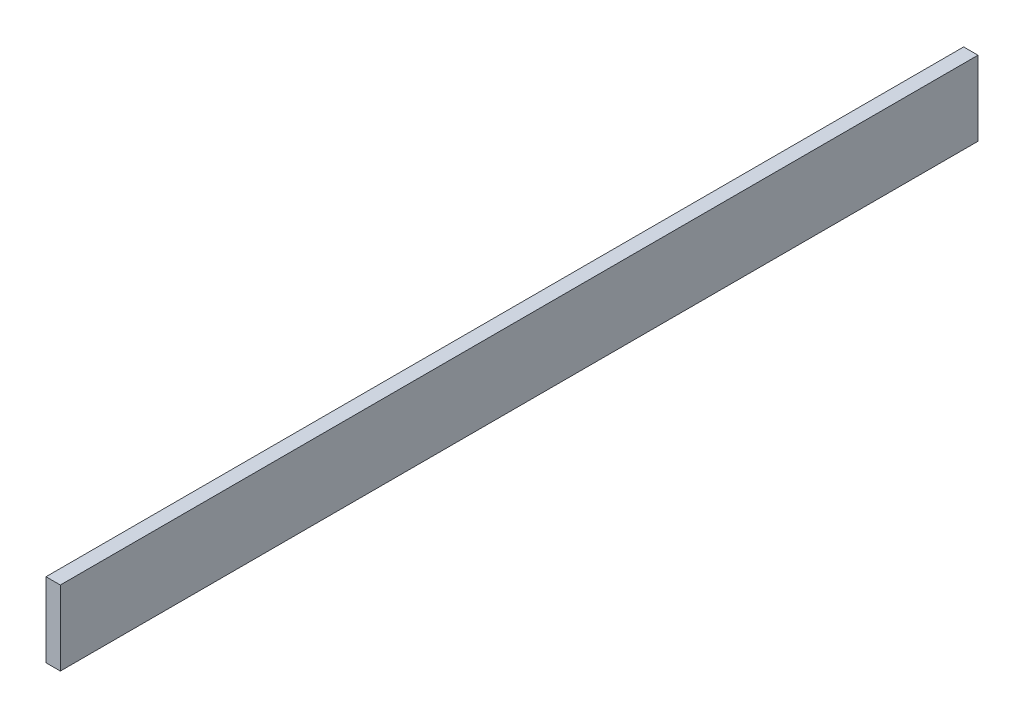
ISO-10303-21;
HEADER;
FILE_DESCRIPTION(('STEP AP214'),'2;1');
FILE_NAME('part.step','',(''),(''),'','','');
FILE_SCHEMA(('AUTOMOTIVE_DESIGN { 1 0 10303 214 1 1 1 1 }'));
ENDSEC;
DATA;
#1=APPLICATION_CONTEXT('core data for automotive mechanical design processes');
#2=APPLICATION_PROTOCOL_DEFINITION('international standard','automotive_design',2000,#1);
#3=PRODUCT_CONTEXT('',#1,'mechanical');
#4=PRODUCT('Part','Part','',(#3));
#5=PRODUCT_RELATED_PRODUCT_CATEGORY('part','',(#4));
#6=PRODUCT_DEFINITION_FORMATION('','',#4);
#7=PRODUCT_DEFINITION_CONTEXT('part definition',#1,'design');
#8=PRODUCT_DEFINITION('design','',#6,#7);
#9=PRODUCT_DEFINITION_SHAPE('','',#8);
#10=(LENGTH_UNIT() NAMED_UNIT(*) SI_UNIT(.MILLI.,.METRE.));
#11=(NAMED_UNIT(*) PLANE_ANGLE_UNIT() SI_UNIT($,.RADIAN.));
#12=(NAMED_UNIT(*) SI_UNIT($,.STERADIAN.) SOLID_ANGLE_UNIT());
#13=UNCERTAINTY_MEASURE_WITH_UNIT(LENGTH_MEASURE(1.E-05),#10,'distance_accuracy_value','');
#14=(GEOMETRIC_REPRESENTATION_CONTEXT(3) GLOBAL_UNCERTAINTY_ASSIGNED_CONTEXT((#13)) GLOBAL_UNIT_ASSIGNED_CONTEXT((#10,
#11,#12)) REPRESENTATION_CONTEXT('',''));
#15=CARTESIAN_POINT('',(0.,0.,0.));
#16=DIRECTION('',(0.,0.,1.));
#17=DIRECTION('',(1.,0.,0.));
#18=AXIS2_PLACEMENT_3D('',#15,#16,#17);
#19=CARTESIAN_POINT('',(6.35,0.,0.));
#20=DIRECTION('',(0.,0.,-1.));
#21=DIRECTION('',(-1.,0.,0.));
#22=AXIS2_PLACEMENT_3D('',#19,#20,#21);
#23=PLANE('',#22);
#24=DIRECTION('',(0.,-1.,0.));
#25=VECTOR('',#24,1.);
#26=CARTESIAN_POINT('',(0.,0.,0.));
#27=LINE('',#26,#25);
#28=CARTESIAN_POINT('',(0.,33.02,0.));
#29=VERTEX_POINT('',#28);
#30=CARTESIAN_POINT('',(0.,0.,0.));
#31=VERTEX_POINT('',#30);
#32=EDGE_CURVE('E99',#29,#31,#27,.T.);
#33=ORIENTED_EDGE('',*,*,#32,.T.);
#34=DIRECTION('',(-1.,0.,0.));
#35=VECTOR('',#34,1.);
#36=CARTESIAN_POINT('',(6.35,0.,0.));
#37=LINE('',#36,#35);
#38=CARTESIAN_POINT('',(6.35,0.,0.));
#39=VERTEX_POINT('',#38);
#40=EDGE_CURVE('E11',#39,#31,#37,.T.);
#41=ORIENTED_EDGE('',*,*,#40,.F.);
#42=DIRECTION('',(0.,-1.,0.));
#43=VECTOR('',#42,1.);
#44=CARTESIAN_POINT('',(6.35,0.,0.));
#45=LINE('',#44,#43);
#46=CARTESIAN_POINT('',(6.35,33.02,0.));
#47=VERTEX_POINT('',#46);
#48=EDGE_CURVE('E87',#47,#39,#45,.T.);
#49=ORIENTED_EDGE('',*,*,#48,.F.);
#50=DIRECTION('',(-1.,0.,0.));
#51=VECTOR('',#50,1.);
#52=CARTESIAN_POINT('',(6.35,33.02,0.));
#53=LINE('',#52,#51);
#54=EDGE_CURVE('E95',#47,#29,#53,.T.);
#55=ORIENTED_EDGE('',*,*,#54,.T.);
#56=EDGE_LOOP('',(#33,#41,#49,#55));
#57=FACE_BOUND('',#56,.T.);
#58=ADVANCED_FACE('F36',(#57),#23,.F.);
#59=CARTESIAN_POINT('',(6.35,0.,0.));
#60=DIRECTION('',(0.,1.,0.));
#61=DIRECTION('',(0.,0.,1.));
#62=AXIS2_PLACEMENT_3D('',#59,#60,#61);
#63=PLANE('',#62);
#64=DIRECTION('',(0.,0.,-1.));
#65=VECTOR('',#64,1.);
#66=CARTESIAN_POINT('',(0.,0.,0.));
#67=LINE('',#66,#65);
#68=CARTESIAN_POINT('',(0.,0.,-406.4));
#69=VERTEX_POINT('',#68);
#70=EDGE_CURVE('E91',#31,#69,#67,.T.);
#71=ORIENTED_EDGE('',*,*,#70,.T.);
#72=DIRECTION('',(-1.,0.,0.));
#73=VECTOR('',#72,1.);
#74=CARTESIAN_POINT('',(6.35,0.,-406.4));
#75=LINE('',#74,#73);
#76=CARTESIAN_POINT('',(6.35,0.,-406.4));
#77=VERTEX_POINT('',#76);
#78=EDGE_CURVE('E44',#77,#69,#75,.T.);
#79=ORIENTED_EDGE('',*,*,#78,.F.);
#80=DIRECTION('',(0.,0.,-1.));
#81=VECTOR('',#80,1.);
#82=CARTESIAN_POINT('',(6.35,0.,0.));
#83=LINE('',#82,#81);
#84=EDGE_CURVE('E82',#39,#77,#83,.T.);
#85=ORIENTED_EDGE('',*,*,#84,.F.);
#86=ORIENTED_EDGE('',*,*,#40,.T.);
#87=EDGE_LOOP('',(#71,#79,#85,#86));
#88=FACE_BOUND('',#87,.T.);
#89=ADVANCED_FACE('F90',(#88),#63,.F.);
#90=CARTESIAN_POINT('',(6.35,0.,-406.4));
#91=DIRECTION('',(0.,0.,1.));
#92=DIRECTION('',(1.,0.,0.));
#93=AXIS2_PLACEMENT_3D('',#90,#91,#92);
#94=PLANE('',#93);
#95=DIRECTION('',(0.,1.,0.));
#96=VECTOR('',#95,1.);
#97=CARTESIAN_POINT('',(0.,0.,-406.4));
#98=LINE('',#97,#96);
#99=CARTESIAN_POINT('',(0.,33.02,-406.4));
#100=VERTEX_POINT('',#99);
#101=EDGE_CURVE('E69',#69,#100,#98,.T.);
#102=ORIENTED_EDGE('',*,*,#101,.T.);
#103=DIRECTION('',(-1.,0.,0.));
#104=VECTOR('',#103,1.);
#105=CARTESIAN_POINT('',(6.35,33.02,-406.4));
#106=LINE('',#105,#104);
#107=CARTESIAN_POINT('',(6.35,33.02,-406.4));
#108=VERTEX_POINT('',#107);
#109=EDGE_CURVE('E92',#108,#100,#106,.T.);
#110=ORIENTED_EDGE('',*,*,#109,.F.);
#111=DIRECTION('',(0.,1.,0.));
#112=VECTOR('',#111,1.);
#113=CARTESIAN_POINT('',(6.35,0.,-406.4));
#114=LINE('',#113,#112);
#115=EDGE_CURVE('E85',#77,#108,#114,.T.);
#116=ORIENTED_EDGE('',*,*,#115,.F.);
#117=ORIENTED_EDGE('',*,*,#78,.T.);
#118=EDGE_LOOP('',(#102,#110,#116,#117));
#119=FACE_BOUND('',#118,.T.);
#120=ADVANCED_FACE('F93',(#119),#94,.F.);
#121=CARTESIAN_POINT('',(6.35,33.02,0.));
#122=DIRECTION('',(0.,-1.,0.));
#123=DIRECTION('',(0.,0.,-1.));
#124=AXIS2_PLACEMENT_3D('',#121,#122,#123);
#125=PLANE('',#124);
#126=DIRECTION('',(0.,0.,1.));
#127=VECTOR('',#126,1.);
#128=CARTESIAN_POINT('',(0.,33.02,0.));
#129=LINE('',#128,#127);
#130=EDGE_CURVE('E75',#100,#29,#129,.T.);
#131=ORIENTED_EDGE('',*,*,#130,.T.);
#132=ORIENTED_EDGE('',*,*,#54,.F.);
#133=DIRECTION('',(0.,0.,1.));
#134=VECTOR('',#133,1.);
#135=CARTESIAN_POINT('',(6.35,33.02,0.));
#136=LINE('',#135,#134);
#137=EDGE_CURVE('E52',#108,#47,#136,.T.);
#138=ORIENTED_EDGE('',*,*,#137,.F.);
#139=ORIENTED_EDGE('',*,*,#109,.T.);
#140=EDGE_LOOP('',(#131,#132,#138,#139));
#141=FACE_BOUND('',#140,.T.);
#142=ADVANCED_FACE('F106',(#141),#125,.F.);
#143=CARTESIAN_POINT('',(6.35,0.,0.));
#144=DIRECTION('',(-1.,0.,0.));
#145=DIRECTION('',(0.,0.,1.));
#146=AXIS2_PLACEMENT_3D('',#143,#144,#145);
#147=PLANE('',#146);
#148=ORIENTED_EDGE('',*,*,#48,.T.);
#149=ORIENTED_EDGE('',*,*,#84,.T.);
#150=ORIENTED_EDGE('',*,*,#115,.T.);
#151=ORIENTED_EDGE('',*,*,#137,.T.);
#152=EDGE_LOOP('',(#148,#149,#150,#151));
#153=FACE_BOUND('',#152,.T.);
#154=ADVANCED_FACE('F83',(#153),#147,.F.);
#155=CARTESIAN_POINT('',(0.,0.,0.));
#156=DIRECTION('',(-1.,0.,0.));
#157=DIRECTION('',(0.,0.,1.));
#158=AXIS2_PLACEMENT_3D('',#155,#156,#157);
#159=PLANE('',#158);
#160=ORIENTED_EDGE('',*,*,#32,.F.);
#161=ORIENTED_EDGE('',*,*,#130,.F.);
#162=ORIENTED_EDGE('',*,*,#101,.F.);
#163=ORIENTED_EDGE('',*,*,#70,.F.);
#164=EDGE_LOOP('',(#160,#161,#162,#163));
#165=FACE_BOUND('',#164,.T.);
#166=ADVANCED_FACE('F109',(#165),#159,.T.);
#167=CLOSED_SHELL('',(#58,#89,#120,#142,#154,#166));
#168=MANIFOLD_SOLID_BREP('B2',#167);
#169=ADVANCED_BREP_SHAPE_REPRESENTATION('',(#18,#168),#14);
#170=SHAPE_DEFINITION_REPRESENTATION(#9,#169);
ENDSEC;
END-ISO-10303-21;
